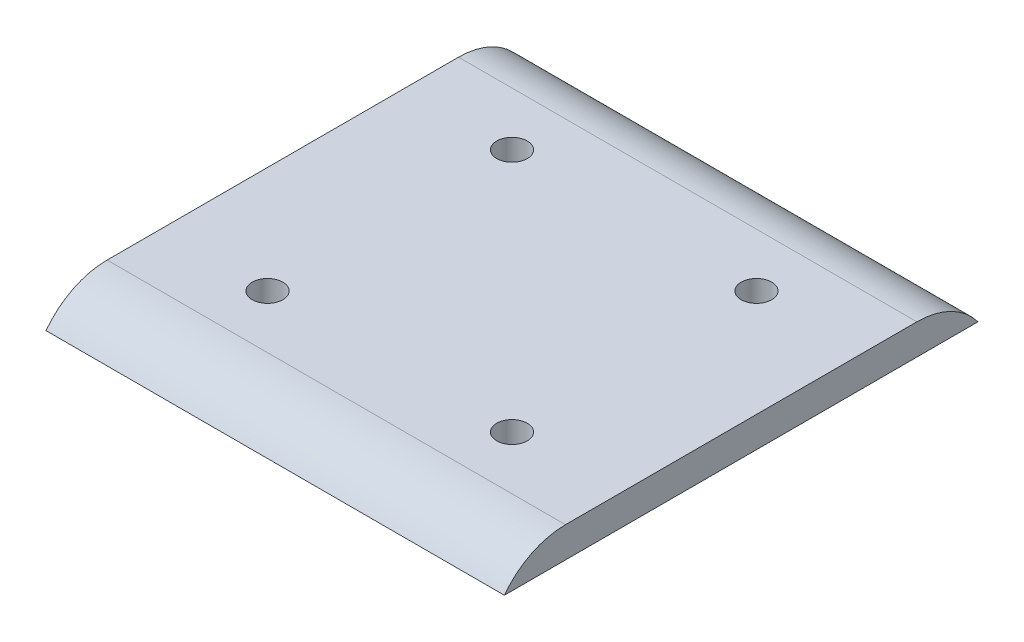
ISO-10303-21;
HEADER;
FILE_DESCRIPTION(('STEP AP214'),'2;1');
FILE_NAME('part.step','',(''),(''),'','','');
FILE_SCHEMA(('AUTOMOTIVE_DESIGN { 1 0 10303 214 1 1 1 1 }'));
ENDSEC;
DATA;
#1=APPLICATION_CONTEXT('core data for automotive mechanical design processes');
#2=APPLICATION_PROTOCOL_DEFINITION('international standard','automotive_design',2000,#1);
#3=PRODUCT_CONTEXT('',#1,'mechanical');
#4=PRODUCT('Part','Part','',(#3));
#5=PRODUCT_RELATED_PRODUCT_CATEGORY('part','',(#4));
#6=PRODUCT_DEFINITION_FORMATION('','',#4);
#7=PRODUCT_DEFINITION_CONTEXT('part definition',#1,'design');
#8=PRODUCT_DEFINITION('design','',#6,#7);
#9=PRODUCT_DEFINITION_SHAPE('','',#8);
#10=(LENGTH_UNIT() NAMED_UNIT(*) SI_UNIT(.MILLI.,.METRE.));
#11=(NAMED_UNIT(*) PLANE_ANGLE_UNIT() SI_UNIT($,.RADIAN.));
#12=(NAMED_UNIT(*) SI_UNIT($,.STERADIAN.) SOLID_ANGLE_UNIT());
#13=UNCERTAINTY_MEASURE_WITH_UNIT(LENGTH_MEASURE(1.E-05),#10,'distance_accuracy_value','');
#14=(GEOMETRIC_REPRESENTATION_CONTEXT(3) GLOBAL_UNCERTAINTY_ASSIGNED_CONTEXT((#13)) GLOBAL_UNIT_ASSIGNED_CONTEXT((#10,
#11,#12)) REPRESENTATION_CONTEXT('',''));
#15=CARTESIAN_POINT('',(0.,0.,0.));
#16=DIRECTION('',(0.,0.,1.));
#17=DIRECTION('',(1.,0.,0.));
#18=AXIS2_PLACEMENT_3D('',#15,#16,#17);
#19=CARTESIAN_POINT('',(-17.3267326732673,2.,-10.990099009901));
#20=DIRECTION('',(1.,0.,0.));
#21=DIRECTION('',(0.,0.,-1.));
#22=AXIS2_PLACEMENT_3D('',#19,#20,#21);
#23=PLANE('',#22);
#24=DIRECTION('',(0.,0.,1.));
#25=VECTOR('',#24,1.);
#26=CARTESIAN_POINT('',(-17.3267326732673,2.,-10.990099009901));
#27=LINE('',#26,#25);
#28=CARTESIAN_POINT('',(-17.3267326732673,2.,-6.99009900990099));
#29=VERTEX_POINT('',#28);
#30=CARTESIAN_POINT('',(-17.3267326732673,2.,16.009900990099));
#31=VERTEX_POINT('',#30);
#32=EDGE_CURVE('E122',#29,#31,#27,.T.);
#33=ORIENTED_EDGE('',*,*,#32,.F.);
#34=CARTESIAN_POINT('',(-17.3267326732673,-3.,-6.99009900990099));
#35=DIRECTION('',(1.,0.,0.));
#36=DIRECTION('',(0.,0.,-1.));
#37=AXIS2_PLACEMENT_3D('',#34,#35,#36);
#38=CIRCLE('',#37,5.);
#39=CARTESIAN_POINT('',(-17.3267326732673,0.,-10.990099009901));
#40=VERTEX_POINT('',#39);
#41=EDGE_CURVE('E52',#29,#40,#38,.F.);
#42=ORIENTED_EDGE('',*,*,#41,.T.);
#43=DIRECTION('',(0.,0.,1.));
#44=VECTOR('',#43,1.);
#45=CARTESIAN_POINT('',(-17.3267326732673,0.,-10.990099009901));
#46=LINE('',#45,#44);
#47=CARTESIAN_POINT('',(-17.3267326732673,0.,20.009900990099));
#48=VERTEX_POINT('',#47);
#49=EDGE_CURVE('E89',#40,#48,#46,.T.);
#50=ORIENTED_EDGE('',*,*,#49,.T.);
#51=CARTESIAN_POINT('',(-17.3267326732673,-3.,16.009900990099));
#52=DIRECTION('',(1.,0.,0.));
#53=DIRECTION('',(0.,0.,-1.));
#54=AXIS2_PLACEMENT_3D('',#51,#52,#53);
#55=CIRCLE('',#54,5.);
#56=EDGE_CURVE('E98',#48,#31,#55,.F.);
#57=ORIENTED_EDGE('',*,*,#56,.T.);
#58=EDGE_LOOP('',(#33,#42,#50,#57));
#59=FACE_BOUND('',#58,.T.);
#60=ADVANCED_FACE('F43',(#59),#23,.F.);
#61=CARTESIAN_POINT('',(12.6732673267327,2.,-10.990099009901));
#62=DIRECTION('',(-1.,0.,0.));
#63=DIRECTION('',(0.,0.,1.));
#64=AXIS2_PLACEMENT_3D('',#61,#62,#63);
#65=PLANE('',#64);
#66=DIRECTION('',(0.,0.,-1.));
#67=VECTOR('',#66,1.);
#68=CARTESIAN_POINT('',(12.6732673267327,0.,-10.990099009901));
#69=LINE('',#68,#67);
#70=CARTESIAN_POINT('',(12.6732673267327,0.,20.009900990099));
#71=VERTEX_POINT('',#70);
#72=CARTESIAN_POINT('',(12.6732673267327,0.,-10.990099009901));
#73=VERTEX_POINT('',#72);
#74=EDGE_CURVE('E90',#71,#73,#69,.T.);
#75=ORIENTED_EDGE('',*,*,#74,.T.);
#76=CARTESIAN_POINT('',(12.6732673267327,-3.,-6.99009900990099));
#77=DIRECTION('',(-1.,0.,0.));
#78=DIRECTION('',(0.,0.,1.));
#79=AXIS2_PLACEMENT_3D('',#76,#77,#78);
#80=CIRCLE('',#79,5.);
#81=CARTESIAN_POINT('',(12.6732673267327,2.,-6.99009900990099));
#82=VERTEX_POINT('',#81);
#83=EDGE_CURVE('E11',#73,#82,#80,.F.);
#84=ORIENTED_EDGE('',*,*,#83,.T.);
#85=DIRECTION('',(0.,0.,-1.));
#86=VECTOR('',#85,1.);
#87=CARTESIAN_POINT('',(12.6732673267327,2.,-10.990099009901));
#88=LINE('',#87,#86);
#89=CARTESIAN_POINT('',(12.6732673267327,2.,16.009900990099));
#90=VERTEX_POINT('',#89);
#91=EDGE_CURVE('E118',#90,#82,#88,.T.);
#92=ORIENTED_EDGE('',*,*,#91,.F.);
#93=CARTESIAN_POINT('',(12.6732673267327,-3.,16.009900990099));
#94=DIRECTION('',(-1.,0.,0.));
#95=DIRECTION('',(0.,0.,1.));
#96=AXIS2_PLACEMENT_3D('',#93,#94,#95);
#97=CIRCLE('',#96,5.);
#98=EDGE_CURVE('E108',#90,#71,#97,.F.);
#99=ORIENTED_EDGE('',*,*,#98,.T.);
#100=EDGE_LOOP('',(#75,#84,#92,#99));
#101=FACE_BOUND('',#100,.T.);
#102=ADVANCED_FACE('F181',(#101),#65,.F.);
#103=CARTESIAN_POINT('',(0.,2.,0.));
#104=DIRECTION('',(0.,1.,0.));
#105=DIRECTION('',(0.,0.,1.));
#106=AXIS2_PLACEMENT_3D('',#103,#104,#105);
#107=PLANE('',#106);
#108=CARTESIAN_POINT('',(-10.3267326732673,2.,12.509900990099));
#109=DIRECTION('',(0.,1.,0.));
#110=DIRECTION('',(0.,0.,1.));
#111=AXIS2_PLACEMENT_3D('',#108,#109,#110);
#112=CIRCLE('',#111,1.);
#113=CARTESIAN_POINT('',(-10.3267326732673,2.,13.509900990099));
#114=VERTEX_POINT('',#113);
#115=EDGE_CURVE('E101',#114,#114,#112,.F.);
#116=ORIENTED_EDGE('',*,*,#115,.T.);
#117=EDGE_LOOP('',(#116));
#118=FACE_BOUND('',#117,.T.);
#119=CARTESIAN_POINT('',(5.67326732673267,2.,-3.49009900990099));
#120=DIRECTION('',(0.,1.,0.));
#121=DIRECTION('',(0.,0.,1.));
#122=AXIS2_PLACEMENT_3D('',#119,#120,#121);
#123=CIRCLE('',#122,1.);
#124=CARTESIAN_POINT('',(5.67326732673267,2.,-2.49009900990098));
#125=VERTEX_POINT('',#124);
#126=EDGE_CURVE('E132',#125,#125,#123,.F.);
#127=ORIENTED_EDGE('',*,*,#126,.T.);
#128=EDGE_LOOP('',(#127));
#129=FACE_BOUND('',#128,.T.);
#130=CARTESIAN_POINT('',(5.67326732673267,2.,12.509900990099));
#131=DIRECTION('',(0.,1.,0.));
#132=DIRECTION('',(0.,0.,1.));
#133=AXIS2_PLACEMENT_3D('',#130,#131,#132);
#134=CIRCLE('',#133,1.);
#135=CARTESIAN_POINT('',(5.67326732673267,2.,13.509900990099));
#136=VERTEX_POINT('',#135);
#137=EDGE_CURVE('E136',#136,#136,#134,.F.);
#138=ORIENTED_EDGE('',*,*,#137,.T.);
#139=EDGE_LOOP('',(#138));
#140=FACE_BOUND('',#139,.T.);
#141=CARTESIAN_POINT('',(-10.3267326732673,2.,-3.49009900990099));
#142=DIRECTION('',(0.,1.,0.));
#143=DIRECTION('',(0.,0.,1.));
#144=AXIS2_PLACEMENT_3D('',#141,#142,#143);
#145=CIRCLE('',#144,1.);
#146=CARTESIAN_POINT('',(-10.3267326732673,2.,-2.49009900990098));
#147=VERTEX_POINT('',#146);
#148=EDGE_CURVE('E140',#147,#147,#145,.F.);
#149=ORIENTED_EDGE('',*,*,#148,.T.);
#150=EDGE_LOOP('',(#149));
#151=FACE_BOUND('',#150,.T.);
#152=ORIENTED_EDGE('',*,*,#91,.T.);
#153=DIRECTION('',(1.,0.,0.));
#154=VECTOR('',#153,1.);
#155=CARTESIAN_POINT('',(-17.3267326732673,2.,-6.99009900990099));
#156=LINE('',#155,#154);
#157=EDGE_CURVE('E107',#82,#29,#156,.F.);
#158=ORIENTED_EDGE('',*,*,#157,.T.);
#159=ORIENTED_EDGE('',*,*,#32,.T.);
#160=DIRECTION('',(-1.,0.,0.));
#161=VECTOR('',#160,1.);
#162=CARTESIAN_POINT('',(12.6732673267327,2.,16.009900990099));
#163=LINE('',#162,#161);
#164=EDGE_CURVE('E105',#31,#90,#163,.F.);
#165=ORIENTED_EDGE('',*,*,#164,.T.);
#166=EDGE_LOOP('',(#152,#158,#159,#165));
#167=FACE_BOUND('',#166,.T.);
#168=ADVANCED_FACE('F186',(#118,#129,#140,#151,#167),#107,.T.);
#169=CARTESIAN_POINT('',(0.,0.,0.));
#170=DIRECTION('',(0.,1.,0.));
#171=DIRECTION('',(0.,0.,1.));
#172=AXIS2_PLACEMENT_3D('',#169,#170,#171);
#173=PLANE('',#172);
#174=CARTESIAN_POINT('',(-10.3267326732673,0.,12.509900990099));
#175=DIRECTION('',(0.,1.,0.));
#176=DIRECTION('',(0.,0.,1.));
#177=AXIS2_PLACEMENT_3D('',#174,#175,#176);
#178=CIRCLE('',#177,1.);
#179=CARTESIAN_POINT('',(-10.3267326732673,0.,13.509900990099));
#180=VERTEX_POINT('',#179);
#181=EDGE_CURVE('E148',#180,#180,#178,.T.);
#182=ORIENTED_EDGE('',*,*,#181,.T.);
#183=EDGE_LOOP('',(#182));
#184=FACE_BOUND('',#183,.T.);
#185=CARTESIAN_POINT('',(5.67326732673267,0.,-3.49009900990099));
#186=DIRECTION('',(0.,1.,0.));
#187=DIRECTION('',(0.,0.,1.));
#188=AXIS2_PLACEMENT_3D('',#185,#186,#187);
#189=CIRCLE('',#188,1.);
#190=CARTESIAN_POINT('',(5.67326732673267,0.,-2.49009900990098));
#191=VERTEX_POINT('',#190);
#192=EDGE_CURVE('E149',#191,#191,#189,.T.);
#193=ORIENTED_EDGE('',*,*,#192,.T.);
#194=EDGE_LOOP('',(#193));
#195=FACE_BOUND('',#194,.T.);
#196=CARTESIAN_POINT('',(5.67326732673267,0.,12.509900990099));
#197=DIRECTION('',(0.,1.,0.));
#198=DIRECTION('',(0.,0.,1.));
#199=AXIS2_PLACEMENT_3D('',#196,#197,#198);
#200=CIRCLE('',#199,1.);
#201=CARTESIAN_POINT('',(5.67326732673267,0.,13.509900990099));
#202=VERTEX_POINT('',#201);
#203=EDGE_CURVE('E153',#202,#202,#200,.T.);
#204=ORIENTED_EDGE('',*,*,#203,.T.);
#205=EDGE_LOOP('',(#204));
#206=FACE_BOUND('',#205,.T.);
#207=CARTESIAN_POINT('',(-10.3267326732673,0.,-3.49009900990099));
#208=DIRECTION('',(0.,1.,0.));
#209=DIRECTION('',(0.,0.,1.));
#210=AXIS2_PLACEMENT_3D('',#207,#208,#209);
#211=CIRCLE('',#210,1.);
#212=CARTESIAN_POINT('',(-10.3267326732673,0.,-2.49009900990098));
#213=VERTEX_POINT('',#212);
#214=EDGE_CURVE('E144',#213,#213,#211,.T.);
#215=ORIENTED_EDGE('',*,*,#214,.T.);
#216=EDGE_LOOP('',(#215));
#217=FACE_BOUND('',#216,.T.);
#218=ORIENTED_EDGE('',*,*,#49,.F.);
#219=DIRECTION('',(-1.,0.,0.));
#220=VECTOR('',#219,1.);
#221=CARTESIAN_POINT('',(-17.3267326732673,0.,-10.990099009901));
#222=LINE('',#221,#220);
#223=EDGE_CURVE('E119',#73,#40,#222,.T.);
#224=ORIENTED_EDGE('',*,*,#223,.F.);
#225=ORIENTED_EDGE('',*,*,#74,.F.);
#226=DIRECTION('',(1.,0.,0.));
#227=VECTOR('',#226,1.);
#228=CARTESIAN_POINT('',(-17.3267326732673,0.,20.009900990099));
#229=LINE('',#228,#227);
#230=EDGE_CURVE('E85',#48,#71,#229,.T.);
#231=ORIENTED_EDGE('',*,*,#230,.F.);
#232=EDGE_LOOP('',(#218,#224,#225,#231));
#233=FACE_BOUND('',#232,.T.);
#234=ADVANCED_FACE('F87',(#184,#195,#206,#217,#233),#173,.F.);
#235=CARTESIAN_POINT('',(-10.3267326732673,4.,-3.49009900990099));
#236=DIRECTION('',(0.,-1.,0.));
#237=DIRECTION('',(0.,0.,-1.));
#238=AXIS2_PLACEMENT_3D('',#235,#236,#237);
#239=CYLINDRICAL_SURFACE('',#238,1.);
#240=ORIENTED_EDGE('',*,*,#148,.F.);
#241=EDGE_LOOP('',(#240));
#242=FACE_BOUND('',#241,.T.);
#243=ORIENTED_EDGE('',*,*,#214,.F.);
#244=EDGE_LOOP('',(#243));
#245=FACE_BOUND('',#244,.T.);
#246=ADVANCED_FACE('F166',(#242,#245),#239,.F.);
#247=CARTESIAN_POINT('',(5.67326732673267,4.,12.509900990099));
#248=DIRECTION('',(0.,-1.,0.));
#249=DIRECTION('',(0.,0.,-1.));
#250=AXIS2_PLACEMENT_3D('',#247,#248,#249);
#251=CYLINDRICAL_SURFACE('',#250,1.);
#252=ORIENTED_EDGE('',*,*,#137,.F.);
#253=EDGE_LOOP('',(#252));
#254=FACE_BOUND('',#253,.T.);
#255=ORIENTED_EDGE('',*,*,#203,.F.);
#256=EDGE_LOOP('',(#255));
#257=FACE_BOUND('',#256,.T.);
#258=ADVANCED_FACE('F163',(#254,#257),#251,.F.);
#259=CARTESIAN_POINT('',(5.67326732673267,4.,-3.49009900990099));
#260=DIRECTION('',(0.,-1.,0.));
#261=DIRECTION('',(0.,0.,-1.));
#262=AXIS2_PLACEMENT_3D('',#259,#260,#261);
#263=CYLINDRICAL_SURFACE('',#262,1.);
#264=ORIENTED_EDGE('',*,*,#126,.F.);
#265=EDGE_LOOP('',(#264));
#266=FACE_BOUND('',#265,.T.);
#267=ORIENTED_EDGE('',*,*,#192,.F.);
#268=EDGE_LOOP('',(#267));
#269=FACE_BOUND('',#268,.T.);
#270=ADVANCED_FACE('F165',(#266,#269),#263,.F.);
#271=CARTESIAN_POINT('',(-10.3267326732673,4.,12.509900990099));
#272=DIRECTION('',(0.,-1.,0.));
#273=DIRECTION('',(0.,0.,-1.));
#274=AXIS2_PLACEMENT_3D('',#271,#272,#273);
#275=CYLINDRICAL_SURFACE('',#274,1.);
#276=ORIENTED_EDGE('',*,*,#115,.F.);
#277=EDGE_LOOP('',(#276));
#278=FACE_BOUND('',#277,.T.);
#279=ORIENTED_EDGE('',*,*,#181,.F.);
#280=EDGE_LOOP('',(#279));
#281=FACE_BOUND('',#280,.T.);
#282=ADVANCED_FACE('F173',(#278,#281),#275,.F.);
#283=CARTESIAN_POINT('',(-17.3267326732673,-3.,16.009900990099));
#284=DIRECTION('',(1.,0.,0.));
#285=DIRECTION('',(0.,0.,-1.));
#286=AXIS2_PLACEMENT_3D('',#283,#284,#285);
#287=CYLINDRICAL_SURFACE('',#286,5.);
#288=ORIENTED_EDGE('',*,*,#56,.F.);
#289=ORIENTED_EDGE('',*,*,#230,.T.);
#290=ORIENTED_EDGE('',*,*,#98,.F.);
#291=ORIENTED_EDGE('',*,*,#164,.F.);
#292=EDGE_LOOP('',(#288,#289,#290,#291));
#293=FACE_BOUND('',#292,.T.);
#294=ADVANCED_FACE('F103',(#293),#287,.T.);
#295=CARTESIAN_POINT('',(-17.3267326732673,-3.,-6.99009900990099));
#296=DIRECTION('',(-1.,0.,0.));
#297=DIRECTION('',(0.,0.,1.));
#298=AXIS2_PLACEMENT_3D('',#295,#296,#297);
#299=CYLINDRICAL_SURFACE('',#298,5.);
#300=ORIENTED_EDGE('',*,*,#83,.F.);
#301=ORIENTED_EDGE('',*,*,#223,.T.);
#302=ORIENTED_EDGE('',*,*,#41,.F.);
#303=ORIENTED_EDGE('',*,*,#157,.F.);
#304=EDGE_LOOP('',(#300,#301,#302,#303));
#305=FACE_BOUND('',#304,.T.);
#306=ADVANCED_FACE('F45',(#305),#299,.T.);
#307=CLOSED_SHELL('',(#60,#102,#168,#234,#246,#258,#270,#282,#294,#306));
#308=MANIFOLD_SOLID_BREP('B2',#307);
#309=ADVANCED_BREP_SHAPE_REPRESENTATION('',(#18,#308),#14);
#310=SHAPE_DEFINITION_REPRESENTATION(#9,#309);
ENDSEC;
END-ISO-10303-21;
